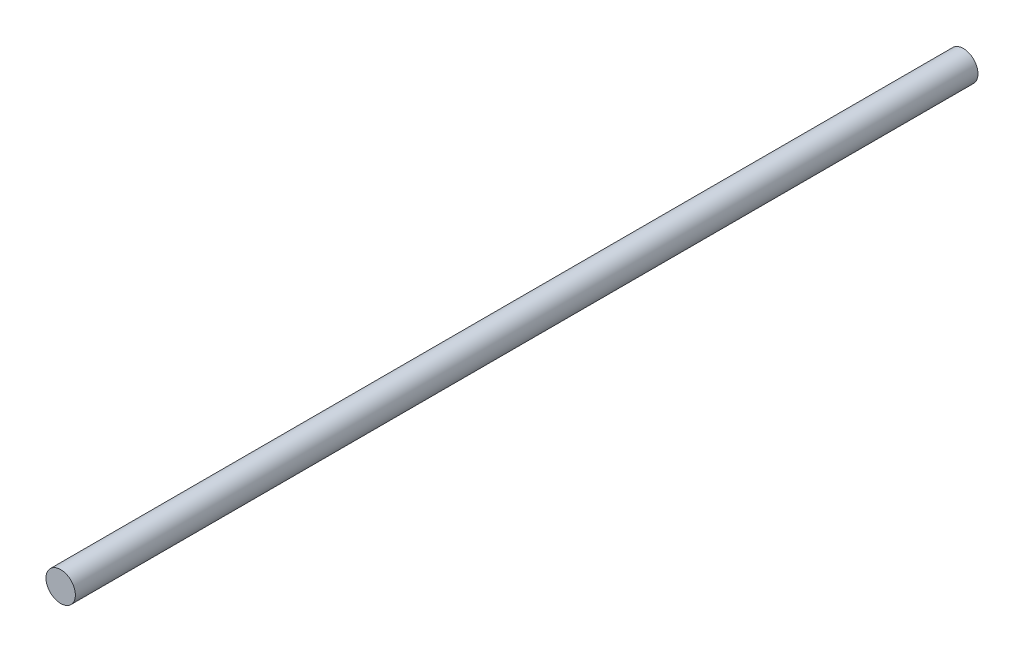
ISO-10303-21;
HEADER;
FILE_DESCRIPTION(('STEP AP214'),'2;1');
FILE_NAME('part.step','',(''),(''),'','','');
FILE_SCHEMA(('AUTOMOTIVE_DESIGN { 1 0 10303 214 1 1 1 1 }'));
ENDSEC;
DATA;
#1=APPLICATION_CONTEXT('core data for automotive mechanical design processes');
#2=APPLICATION_PROTOCOL_DEFINITION('international standard','automotive_design',2000,#1);
#3=PRODUCT_CONTEXT('',#1,'mechanical');
#4=PRODUCT('Part','Part','',(#3));
#5=PRODUCT_RELATED_PRODUCT_CATEGORY('part','',(#4));
#6=PRODUCT_DEFINITION_FORMATION('','',#4);
#7=PRODUCT_DEFINITION_CONTEXT('part definition',#1,'design');
#8=PRODUCT_DEFINITION('design','',#6,#7);
#9=PRODUCT_DEFINITION_SHAPE('','',#8);
#10=(LENGTH_UNIT() NAMED_UNIT(*) SI_UNIT(.MILLI.,.METRE.));
#11=(NAMED_UNIT(*) PLANE_ANGLE_UNIT() SI_UNIT($,.RADIAN.));
#12=(NAMED_UNIT(*) SI_UNIT($,.STERADIAN.) SOLID_ANGLE_UNIT());
#13=UNCERTAINTY_MEASURE_WITH_UNIT(LENGTH_MEASURE(1.E-05),#10,'distance_accuracy_value','');
#14=(GEOMETRIC_REPRESENTATION_CONTEXT(3) GLOBAL_UNCERTAINTY_ASSIGNED_CONTEXT((#13)) GLOBAL_UNIT_ASSIGNED_CONTEXT((#10,
#11,#12)) REPRESENTATION_CONTEXT('',''));
#15=CARTESIAN_POINT('',(0.,0.,0.));
#16=DIRECTION('',(0.,0.,1.));
#17=DIRECTION('',(1.,0.,0.));
#18=AXIS2_PLACEMENT_3D('',#15,#16,#17);
#19=CARTESIAN_POINT('',(0.,0.,153.5));
#20=DIRECTION('',(0.,0.,-1.));
#21=DIRECTION('',(-1.,0.,0.));
#22=AXIS2_PLACEMENT_3D('',#19,#20,#21);
#23=CYLINDRICAL_SURFACE('',#22,2.5);
#24=CARTESIAN_POINT('',(0.,0.,153.5));
#25=DIRECTION('',(0.,0.,1.));
#26=DIRECTION('',(1.,0.,0.));
#27=AXIS2_PLACEMENT_3D('',#24,#25,#26);
#28=CIRCLE('',#27,2.5);
#29=CARTESIAN_POINT('',(2.5,0.,153.5));
#30=VERTEX_POINT('',#29);
#31=EDGE_CURVE('E10',#30,#30,#28,.T.);
#32=ORIENTED_EDGE('',*,*,#31,.F.);
#33=EDGE_LOOP('',(#32));
#34=FACE_BOUND('',#33,.T.);
#35=CARTESIAN_POINT('',(0.,0.,0.));
#36=DIRECTION('',(0.,0.,1.));
#37=DIRECTION('',(1.,0.,0.));
#38=AXIS2_PLACEMENT_3D('',#35,#36,#37);
#39=CIRCLE('',#38,2.5);
#40=CARTESIAN_POINT('',(2.5,0.,0.));
#41=VERTEX_POINT('',#40);
#42=EDGE_CURVE('E46',#41,#41,#39,.T.);
#43=ORIENTED_EDGE('',*,*,#42,.T.);
#44=EDGE_LOOP('',(#43));
#45=FACE_BOUND('',#44,.T.);
#46=ADVANCED_FACE('F43',(#34,#45),#23,.T.);
#47=CARTESIAN_POINT('',(0.,0.,153.5));
#48=DIRECTION('',(0.,0.,1.));
#49=DIRECTION('',(1.,0.,0.));
#50=AXIS2_PLACEMENT_3D('',#47,#48,#49);
#51=PLANE('',#50);
#52=ORIENTED_EDGE('',*,*,#31,.T.);
#53=EDGE_LOOP('',(#52));
#54=FACE_BOUND('',#53,.T.);
#55=ADVANCED_FACE('F58',(#54),#51,.T.);
#56=CARTESIAN_POINT('',(0.,0.,0.));
#57=DIRECTION('',(0.,0.,1.));
#58=DIRECTION('',(1.,0.,0.));
#59=AXIS2_PLACEMENT_3D('',#56,#57,#58);
#60=PLANE('',#59);
#61=ORIENTED_EDGE('',*,*,#42,.F.);
#62=EDGE_LOOP('',(#61));
#63=FACE_BOUND('',#62,.T.);
#64=ADVANCED_FACE('F59',(#63),#60,.F.);
#65=CLOSED_SHELL('',(#46,#55,#64));
#66=MANIFOLD_SOLID_BREP('B2',#65);
#67=ADVANCED_BREP_SHAPE_REPRESENTATION('',(#18,#66),#14);
#68=SHAPE_DEFINITION_REPRESENTATION(#9,#67);
ENDSEC;
END-ISO-10303-21;
